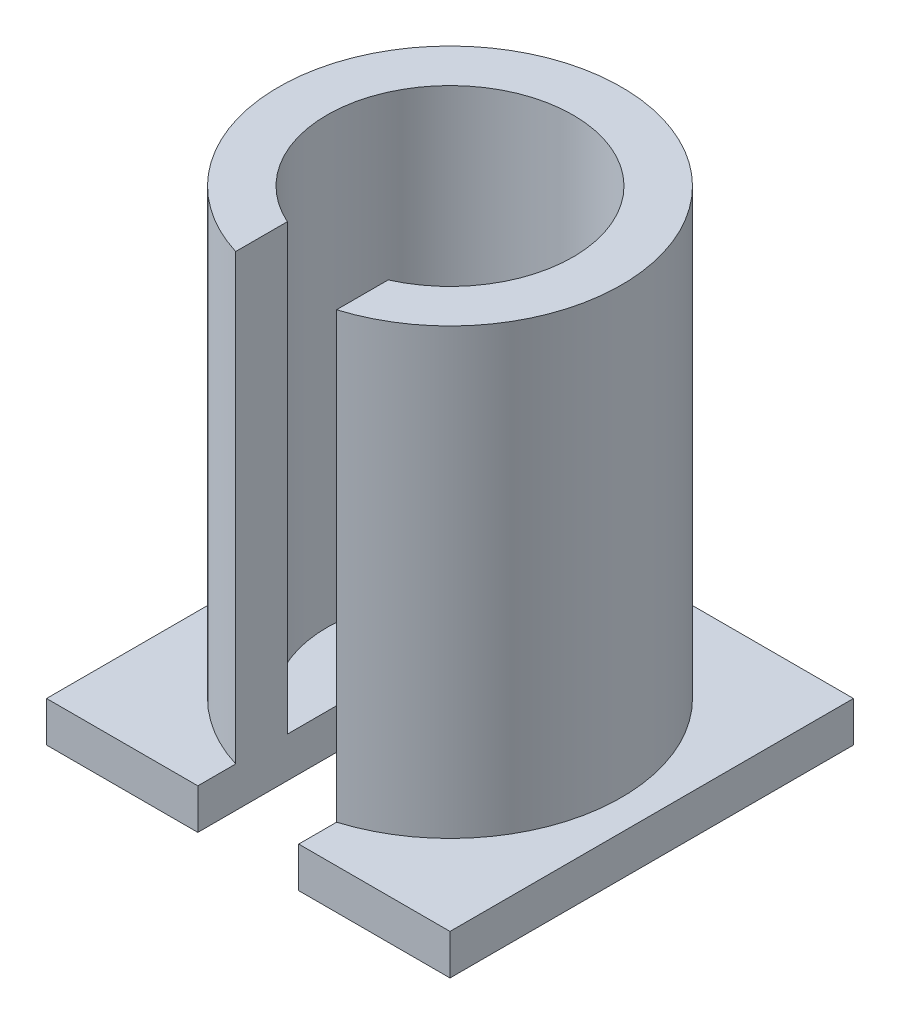
ISO-10303-21;
HEADER;
FILE_DESCRIPTION(('STEP AP214'),'2;1');
FILE_NAME('part.step','',(''),(''),'','','');
FILE_SCHEMA(('AUTOMOTIVE_DESIGN { 1 0 10303 214 1 1 1 1 }'));
ENDSEC;
DATA;
#1=APPLICATION_CONTEXT('core data for automotive mechanical design processes');
#2=APPLICATION_PROTOCOL_DEFINITION('international standard','automotive_design',2000,#1);
#3=PRODUCT_CONTEXT('',#1,'mechanical');
#4=PRODUCT('Part','Part','',(#3));
#5=PRODUCT_RELATED_PRODUCT_CATEGORY('part','',(#4));
#6=PRODUCT_DEFINITION_FORMATION('','',#4);
#7=PRODUCT_DEFINITION_CONTEXT('part definition',#1,'design');
#8=PRODUCT_DEFINITION('design','',#6,#7);
#9=PRODUCT_DEFINITION_SHAPE('','',#8);
#10=(LENGTH_UNIT() NAMED_UNIT(*) SI_UNIT(.MILLI.,.METRE.));
#11=(NAMED_UNIT(*) PLANE_ANGLE_UNIT() SI_UNIT($,.RADIAN.));
#12=(NAMED_UNIT(*) SI_UNIT($,.STERADIAN.) SOLID_ANGLE_UNIT());
#13=UNCERTAINTY_MEASURE_WITH_UNIT(LENGTH_MEASURE(1.E-05),#10,'distance_accuracy_value','');
#14=(GEOMETRIC_REPRESENTATION_CONTEXT(3) GLOBAL_UNCERTAINTY_ASSIGNED_CONTEXT((#13)) GLOBAL_UNIT_ASSIGNED_CONTEXT((#10,
#11,#12)) REPRESENTATION_CONTEXT('',''));
#15=CARTESIAN_POINT('',(0.,0.,0.));
#16=DIRECTION('',(0.,0.,1.));
#17=DIRECTION('',(1.,0.,0.));
#18=AXIS2_PLACEMENT_3D('',#15,#16,#17);
#19=CARTESIAN_POINT('',(0.,12.,0.));
#20=DIRECTION('',(0.,-1.,0.));
#21=DIRECTION('',(0.,0.,-1.));
#22=AXIS2_PLACEMENT_3D('',#19,#20,#21);
#23=CYLINDRICAL_SURFACE('',#22,4.25);
#24=DIRECTION('',(0.,-1.,0.));
#25=VECTOR('',#24,1.);
#26=CARTESIAN_POINT('',(1.25,12.,4.06201920231798));
#27=LINE('',#26,#25);
#28=CARTESIAN_POINT('',(1.25,12.,4.06201920231798));
#29=VERTEX_POINT('',#28);
#30=CARTESIAN_POINT('',(1.25,1.,4.06201920231798));
#31=VERTEX_POINT('',#30);
#32=EDGE_CURVE('E56',#29,#31,#27,.T.);
#33=ORIENTED_EDGE('',*,*,#32,.T.);
#34=CARTESIAN_POINT('',(0.,1.,0.));
#35=DIRECTION('',(0.,1.,0.));
#36=DIRECTION('',(0.,0.,1.));
#37=AXIS2_PLACEMENT_3D('',#34,#35,#36);
#38=CIRCLE('',#37,4.25);
#39=CARTESIAN_POINT('',(-1.25,1.,4.06201920231798));
#40=VERTEX_POINT('',#39);
#41=EDGE_CURVE('E60',#31,#40,#38,.T.);
#42=ORIENTED_EDGE('',*,*,#41,.T.);
#43=DIRECTION('',(0.,-1.,0.));
#44=VECTOR('',#43,1.);
#45=CARTESIAN_POINT('',(-1.25,12.,4.06201920231798));
#46=LINE('',#45,#44);
#47=CARTESIAN_POINT('',(-1.25,12.,4.06201920231798));
#48=VERTEX_POINT('',#47);
#49=EDGE_CURVE('E236',#48,#40,#46,.T.);
#50=ORIENTED_EDGE('',*,*,#49,.F.);
#51=CARTESIAN_POINT('',(0.,12.,0.));
#52=DIRECTION('',(0.,1.,0.));
#53=DIRECTION('',(0.,0.,1.));
#54=AXIS2_PLACEMENT_3D('',#51,#52,#53);
#55=CIRCLE('',#54,4.25);
#56=EDGE_CURVE('E244',#29,#48,#55,.T.);
#57=ORIENTED_EDGE('',*,*,#56,.F.);
#58=EDGE_LOOP('',(#33,#42,#50,#57));
#59=FACE_BOUND('',#58,.T.);
#60=ADVANCED_FACE('F41',(#59),#23,.T.);
#61=CARTESIAN_POINT('',(0.,12.,0.));
#62=DIRECTION('',(0.,-1.,0.));
#63=DIRECTION('',(0.,0.,-1.));
#64=AXIS2_PLACEMENT_3D('',#61,#62,#63);
#65=CYLINDRICAL_SURFACE('',#64,3.05);
#66=CARTESIAN_POINT('',(0.,12.,0.));
#67=DIRECTION('',(0.,1.,0.));
#68=DIRECTION('',(0.,0.,1.));
#69=AXIS2_PLACEMENT_3D('',#66,#67,#68);
#70=CIRCLE('',#69,3.05);
#71=CARTESIAN_POINT('',(1.25,12.,2.78208554864871));
#72=VERTEX_POINT('',#71);
#73=CARTESIAN_POINT('',(-1.25,12.,2.78208554864871));
#74=VERTEX_POINT('',#73);
#75=EDGE_CURVE('E251',#72,#74,#70,.T.);
#76=ORIENTED_EDGE('',*,*,#75,.T.);
#77=DIRECTION('',(0.,-1.,0.));
#78=VECTOR('',#77,1.);
#79=CARTESIAN_POINT('',(-1.25,12.,2.78208554864871));
#80=LINE('',#79,#78);
#81=CARTESIAN_POINT('',(-1.25,1.,2.78208554864871));
#82=VERTEX_POINT('',#81);
#83=EDGE_CURVE('E228',#74,#82,#80,.T.);
#84=ORIENTED_EDGE('',*,*,#83,.T.);
#85=CARTESIAN_POINT('',(0.,1.,0.));
#86=DIRECTION('',(0.,1.,0.));
#87=DIRECTION('',(0.,0.,1.));
#88=AXIS2_PLACEMENT_3D('',#85,#86,#87);
#89=CIRCLE('',#88,3.05);
#90=CARTESIAN_POINT('',(1.25,1.,2.78208554864871));
#91=VERTEX_POINT('',#90);
#92=EDGE_CURVE('E255',#91,#82,#89,.T.);
#93=ORIENTED_EDGE('',*,*,#92,.F.);
#94=DIRECTION('',(0.,-1.,0.));
#95=VECTOR('',#94,1.);
#96=CARTESIAN_POINT('',(1.25,12.,2.78208554864871));
#97=LINE('',#96,#95);
#98=EDGE_CURVE('E216',#72,#91,#97,.T.);
#99=ORIENTED_EDGE('',*,*,#98,.F.);
#100=EDGE_LOOP('',(#76,#84,#93,#99));
#101=FACE_BOUND('',#100,.T.);
#102=ADVANCED_FACE('F275',(#101),#65,.F.);
#103=CARTESIAN_POINT('',(0.,12.,0.));
#104=DIRECTION('',(0.,1.,0.));
#105=DIRECTION('',(0.,0.,1.));
#106=AXIS2_PLACEMENT_3D('',#103,#104,#105);
#107=PLANE('',#106);
#108=ORIENTED_EDGE('',*,*,#56,.T.);
#109=DIRECTION('',(0.,0.,-1.));
#110=VECTOR('',#109,1.);
#111=CARTESIAN_POINT('',(-1.25,12.,0.));
#112=LINE('',#111,#110);
#113=EDGE_CURVE('E232',#48,#74,#112,.T.);
#114=ORIENTED_EDGE('',*,*,#113,.T.);
#115=ORIENTED_EDGE('',*,*,#75,.F.);
#116=DIRECTION('',(0.,0.,-1.));
#117=VECTOR('',#116,1.);
#118=CARTESIAN_POINT('',(1.25,12.,0.));
#119=LINE('',#118,#117);
#120=EDGE_CURVE('E219',#29,#72,#119,.T.);
#121=ORIENTED_EDGE('',*,*,#120,.F.);
#122=EDGE_LOOP('',(#108,#114,#115,#121));
#123=FACE_BOUND('',#122,.T.);
#124=ADVANCED_FACE('F278',(#123),#107,.T.);
#125=CARTESIAN_POINT('',(0.,0.,0.));
#126=DIRECTION('',(0.,1.,0.));
#127=DIRECTION('',(0.,0.,1.));
#128=AXIS2_PLACEMENT_3D('',#125,#126,#127);
#129=PLANE('',#128);
#130=DIRECTION('',(0.,0.,1.));
#131=VECTOR('',#130,1.);
#132=CARTESIAN_POINT('',(-1.25,0.,0.));
#133=LINE('',#132,#131);
#134=CARTESIAN_POINT('',(-1.25,0.,0.));
#135=VERTEX_POINT('',#134);
#136=CARTESIAN_POINT('',(-1.25,0.,5.));
#137=VERTEX_POINT('',#136);
#138=EDGE_CURVE('E208',#135,#137,#133,.T.);
#139=ORIENTED_EDGE('',*,*,#138,.T.);
#140=DIRECTION('',(-1.,0.,0.));
#141=VECTOR('',#140,1.);
#142=CARTESIAN_POINT('',(0.,0.,5.));
#143=LINE('',#142,#141);
#144=CARTESIAN_POINT('',(-5.,0.,5.));
#145=VERTEX_POINT('',#144);
#146=EDGE_CURVE('E137',#137,#145,#143,.T.);
#147=ORIENTED_EDGE('',*,*,#146,.T.);
#148=DIRECTION('',(0.,0.,-1.));
#149=VECTOR('',#148,1.);
#150=CARTESIAN_POINT('',(-5.,0.,0.));
#151=LINE('',#150,#149);
#152=CARTESIAN_POINT('',(-5.,0.,-5.));
#153=VERTEX_POINT('',#152);
#154=EDGE_CURVE('E187',#145,#153,#151,.T.);
#155=ORIENTED_EDGE('',*,*,#154,.T.);
#156=DIRECTION('',(-1.,0.,0.));
#157=VECTOR('',#156,1.);
#158=CARTESIAN_POINT('',(0.,0.,-5.));
#159=LINE('',#158,#157);
#160=CARTESIAN_POINT('',(5.,0.,-5.));
#161=VERTEX_POINT('',#160);
#162=EDGE_CURVE('E183',#161,#153,#159,.T.);
#163=ORIENTED_EDGE('',*,*,#162,.F.);
#164=DIRECTION('',(0.,0.,-1.));
#165=VECTOR('',#164,1.);
#166=CARTESIAN_POINT('',(5.,0.,0.));
#167=LINE('',#166,#165);
#168=CARTESIAN_POINT('',(5.,0.,5.));
#169=VERTEX_POINT('',#168);
#170=EDGE_CURVE('E180',#169,#161,#167,.T.);
#171=ORIENTED_EDGE('',*,*,#170,.F.);
#172=CARTESIAN_POINT('',(1.25,0.,5.));
#173=VERTEX_POINT('',#172);
#174=EDGE_CURVE('E177',#169,#173,#143,.T.);
#175=ORIENTED_EDGE('',*,*,#174,.T.);
#176=DIRECTION('',(0.,0.,1.));
#177=VECTOR('',#176,1.);
#178=CARTESIAN_POINT('',(1.25,0.,0.));
#179=LINE('',#178,#177);
#180=CARTESIAN_POINT('',(1.25,0.,0.));
#181=VERTEX_POINT('',#180);
#182=EDGE_CURVE('E143',#181,#173,#179,.T.);
#183=ORIENTED_EDGE('',*,*,#182,.F.);
#184=CARTESIAN_POINT('',(0.,0.,0.));
#185=DIRECTION('',(0.,1.,0.));
#186=DIRECTION('',(0.,0.,1.));
#187=AXIS2_PLACEMENT_3D('',#184,#185,#186);
#188=CIRCLE('',#187,1.25);
#189=EDGE_CURVE('E239',#181,#135,#188,.T.);
#190=ORIENTED_EDGE('',*,*,#189,.T.);
#191=EDGE_LOOP('',(#139,#147,#155,#163,#171,#175,#183,#190));
#192=FACE_BOUND('',#191,.T.);
#193=ADVANCED_FACE('F265',(#192),#129,.F.);
#194=CARTESIAN_POINT('',(0.,1.,0.));
#195=DIRECTION('',(0.,1.,0.));
#196=DIRECTION('',(0.,0.,1.));
#197=AXIS2_PLACEMENT_3D('',#194,#195,#196);
#198=PLANE('',#197);
#199=ORIENTED_EDGE('',*,*,#92,.T.);
#200=DIRECTION('',(0.,0.,-1.));
#201=VECTOR('',#200,1.);
#202=CARTESIAN_POINT('',(-1.25,1.,0.));
#203=LINE('',#202,#201);
#204=CARTESIAN_POINT('',(-1.25,1.,0.));
#205=VERTEX_POINT('',#204);
#206=EDGE_CURVE('E224',#82,#205,#203,.T.);
#207=ORIENTED_EDGE('',*,*,#206,.T.);
#208=CARTESIAN_POINT('',(0.,1.,0.));
#209=DIRECTION('',(0.,1.,0.));
#210=DIRECTION('',(0.,0.,1.));
#211=AXIS2_PLACEMENT_3D('',#208,#209,#210);
#212=CIRCLE('',#211,1.25);
#213=CARTESIAN_POINT('',(1.25,1.,0.));
#214=VERTEX_POINT('',#213);
#215=EDGE_CURVE('E240',#214,#205,#212,.T.);
#216=ORIENTED_EDGE('',*,*,#215,.F.);
#217=DIRECTION('',(0.,0.,-1.));
#218=VECTOR('',#217,1.);
#219=CARTESIAN_POINT('',(1.25,1.,0.));
#220=LINE('',#219,#218);
#221=EDGE_CURVE('E213',#91,#214,#220,.T.);
#222=ORIENTED_EDGE('',*,*,#221,.F.);
#223=EDGE_LOOP('',(#199,#207,#216,#222));
#224=FACE_BOUND('',#223,.T.);
#225=ADVANCED_FACE('F271',(#224),#198,.T.);
#226=CARTESIAN_POINT('',(0.,1.,0.));
#227=DIRECTION('',(0.,-1.,0.));
#228=DIRECTION('',(0.,0.,-1.));
#229=AXIS2_PLACEMENT_3D('',#226,#227,#228);
#230=CYLINDRICAL_SURFACE('',#229,1.25);
#231=ORIENTED_EDGE('',*,*,#215,.T.);
#232=DIRECTION('',(0.,-1.,0.));
#233=VECTOR('',#232,1.);
#234=CARTESIAN_POINT('',(-1.25,1.,0.));
#235=LINE('',#234,#233);
#236=EDGE_CURVE('E11',#205,#135,#235,.T.);
#237=ORIENTED_EDGE('',*,*,#236,.T.);
#238=ORIENTED_EDGE('',*,*,#189,.F.);
#239=DIRECTION('',(0.,-1.,0.));
#240=VECTOR('',#239,1.);
#241=CARTESIAN_POINT('',(1.25,1.,0.));
#242=LINE('',#241,#240);
#243=EDGE_CURVE('E49',#214,#181,#242,.T.);
#244=ORIENTED_EDGE('',*,*,#243,.F.);
#245=EDGE_LOOP('',(#231,#237,#238,#244));
#246=FACE_BOUND('',#245,.T.);
#247=ADVANCED_FACE('F267',(#246),#230,.F.);
#248=CARTESIAN_POINT('',(1.25,15.,0.));
#249=DIRECTION('',(1.,0.,0.));
#250=DIRECTION('',(0.,0.,-1.));
#251=AXIS2_PLACEMENT_3D('',#248,#249,#250);
#252=PLANE('',#251);
#253=ORIENTED_EDGE('',*,*,#98,.T.);
#254=ORIENTED_EDGE('',*,*,#221,.T.);
#255=ORIENTED_EDGE('',*,*,#243,.T.);
#256=ORIENTED_EDGE('',*,*,#182,.T.);
#257=DIRECTION('',(0.,-1.,0.));
#258=VECTOR('',#257,1.);
#259=CARTESIAN_POINT('',(1.25,1.,5.));
#260=LINE('',#259,#258);
#261=CARTESIAN_POINT('',(1.25,1.,5.));
#262=VERTEX_POINT('',#261);
#263=EDGE_CURVE('E140',#262,#173,#260,.T.);
#264=ORIENTED_EDGE('',*,*,#263,.F.);
#265=DIRECTION('',(0.,0.,1.));
#266=VECTOR('',#265,1.);
#267=CARTESIAN_POINT('',(1.25,1.,0.));
#268=LINE('',#267,#266);
#269=EDGE_CURVE('E129',#31,#262,#268,.T.);
#270=ORIENTED_EDGE('',*,*,#269,.F.);
#271=ORIENTED_EDGE('',*,*,#32,.F.);
#272=ORIENTED_EDGE('',*,*,#120,.T.);
#273=EDGE_LOOP('',(#253,#254,#255,#256,#264,#270,#271,#272));
#274=FACE_BOUND('',#273,.T.);
#275=ADVANCED_FACE('F141',(#274),#252,.F.);
#276=CARTESIAN_POINT('',(-1.25,15.,0.));
#277=DIRECTION('',(1.,0.,0.));
#278=DIRECTION('',(0.,0.,-1.));
#279=AXIS2_PLACEMENT_3D('',#276,#277,#278);
#280=PLANE('',#279);
#281=ORIENTED_EDGE('',*,*,#49,.T.);
#282=DIRECTION('',(0.,0.,1.));
#283=VECTOR('',#282,1.);
#284=CARTESIAN_POINT('',(-1.25,1.,0.));
#285=LINE('',#284,#283);
#286=CARTESIAN_POINT('',(-1.25,1.,5.));
#287=VERTEX_POINT('',#286);
#288=EDGE_CURVE('E161',#40,#287,#285,.T.);
#289=ORIENTED_EDGE('',*,*,#288,.T.);
#290=DIRECTION('',(0.,-1.,0.));
#291=VECTOR('',#290,1.);
#292=CARTESIAN_POINT('',(-1.25,1.,5.));
#293=LINE('',#292,#291);
#294=EDGE_CURVE('E168',#287,#137,#293,.T.);
#295=ORIENTED_EDGE('',*,*,#294,.T.);
#296=ORIENTED_EDGE('',*,*,#138,.F.);
#297=ORIENTED_EDGE('',*,*,#236,.F.);
#298=ORIENTED_EDGE('',*,*,#206,.F.);
#299=ORIENTED_EDGE('',*,*,#83,.F.);
#300=ORIENTED_EDGE('',*,*,#113,.F.);
#301=EDGE_LOOP('',(#281,#289,#295,#296,#297,#298,#299,#300));
#302=FACE_BOUND('',#301,.T.);
#303=ADVANCED_FACE('F269',(#302),#280,.T.);
#304=CARTESIAN_POINT('',(0.,1.,0.));
#305=DIRECTION('',(0.,1.,0.));
#306=DIRECTION('',(0.,0.,1.));
#307=AXIS2_PLACEMENT_3D('',#304,#305,#306);
#308=PLANE('',#307);
#309=ORIENTED_EDGE('',*,*,#41,.F.);
#310=ORIENTED_EDGE('',*,*,#269,.T.);
#311=DIRECTION('',(-1.,0.,0.));
#312=VECTOR('',#311,1.);
#313=CARTESIAN_POINT('',(0.,1.,5.));
#314=LINE('',#313,#312);
#315=CARTESIAN_POINT('',(5.,1.,5.));
#316=VERTEX_POINT('',#315);
#317=EDGE_CURVE('E133',#316,#262,#314,.T.);
#318=ORIENTED_EDGE('',*,*,#317,.F.);
#319=DIRECTION('',(0.,0.,-1.));
#320=VECTOR('',#319,1.);
#321=CARTESIAN_POINT('',(5.,1.,0.));
#322=LINE('',#321,#320);
#323=CARTESIAN_POINT('',(5.,1.,-5.));
#324=VERTEX_POINT('',#323);
#325=EDGE_CURVE('E153',#316,#324,#322,.T.);
#326=ORIENTED_EDGE('',*,*,#325,.T.);
#327=DIRECTION('',(-1.,0.,0.));
#328=VECTOR('',#327,1.);
#329=CARTESIAN_POINT('',(0.,1.,-5.));
#330=LINE('',#329,#328);
#331=CARTESIAN_POINT('',(-5.,1.,-5.));
#332=VERTEX_POINT('',#331);
#333=EDGE_CURVE('E157',#324,#332,#330,.T.);
#334=ORIENTED_EDGE('',*,*,#333,.T.);
#335=DIRECTION('',(0.,0.,-1.));
#336=VECTOR('',#335,1.);
#337=CARTESIAN_POINT('',(-5.,1.,0.));
#338=LINE('',#337,#336);
#339=CARTESIAN_POINT('',(-5.,1.,5.));
#340=VERTEX_POINT('',#339);
#341=EDGE_CURVE('E162',#340,#332,#338,.T.);
#342=ORIENTED_EDGE('',*,*,#341,.F.);
#343=EDGE_CURVE('E155',#287,#340,#314,.T.);
#344=ORIENTED_EDGE('',*,*,#343,.F.);
#345=ORIENTED_EDGE('',*,*,#288,.F.);
#346=EDGE_LOOP('',(#309,#310,#318,#326,#334,#342,#344,#345));
#347=FACE_BOUND('',#346,.T.);
#348=ADVANCED_FACE('F131',(#347),#308,.T.);
#349=CARTESIAN_POINT('',(0.,1.,5.));
#350=DIRECTION('',(0.,0.,1.));
#351=DIRECTION('',(1.,0.,0.));
#352=AXIS2_PLACEMENT_3D('',#349,#350,#351);
#353=PLANE('',#352);
#354=ORIENTED_EDGE('',*,*,#174,.F.);
#355=DIRECTION('',(0.,-1.,0.));
#356=VECTOR('',#355,1.);
#357=CARTESIAN_POINT('',(5.,1.,5.));
#358=LINE('',#357,#356);
#359=EDGE_CURVE('E148',#316,#169,#358,.T.);
#360=ORIENTED_EDGE('',*,*,#359,.F.);
#361=ORIENTED_EDGE('',*,*,#317,.T.);
#362=ORIENTED_EDGE('',*,*,#263,.T.);
#363=EDGE_LOOP('',(#354,#360,#361,#362));
#364=FACE_BOUND('',#363,.T.);
#365=ADVANCED_FACE('F150',(#364),#353,.T.);
#366=CARTESIAN_POINT('',(5.,1.,0.));
#367=DIRECTION('',(-1.,0.,0.));
#368=DIRECTION('',(0.,0.,1.));
#369=AXIS2_PLACEMENT_3D('',#366,#367,#368);
#370=PLANE('',#369);
#371=ORIENTED_EDGE('',*,*,#170,.T.);
#372=DIRECTION('',(0.,-1.,0.));
#373=VECTOR('',#372,1.);
#374=CARTESIAN_POINT('',(5.,1.,-5.));
#375=LINE('',#374,#373);
#376=EDGE_CURVE('E200',#324,#161,#375,.T.);
#377=ORIENTED_EDGE('',*,*,#376,.F.);
#378=ORIENTED_EDGE('',*,*,#325,.F.);
#379=ORIENTED_EDGE('',*,*,#359,.T.);
#380=EDGE_LOOP('',(#371,#377,#378,#379));
#381=FACE_BOUND('',#380,.T.);
#382=ADVANCED_FACE('F300',(#381),#370,.F.);
#383=CARTESIAN_POINT('',(0.,1.,-5.));
#384=DIRECTION('',(0.,0.,1.));
#385=DIRECTION('',(1.,0.,0.));
#386=AXIS2_PLACEMENT_3D('',#383,#384,#385);
#387=PLANE('',#386);
#388=ORIENTED_EDGE('',*,*,#162,.T.);
#389=DIRECTION('',(0.,-1.,0.));
#390=VECTOR('',#389,1.);
#391=CARTESIAN_POINT('',(-5.,1.,-5.));
#392=LINE('',#391,#390);
#393=EDGE_CURVE('E197',#332,#153,#392,.T.);
#394=ORIENTED_EDGE('',*,*,#393,.F.);
#395=ORIENTED_EDGE('',*,*,#333,.F.);
#396=ORIENTED_EDGE('',*,*,#376,.T.);
#397=EDGE_LOOP('',(#388,#394,#395,#396));
#398=FACE_BOUND('',#397,.T.);
#399=ADVANCED_FACE('F284',(#398),#387,.F.);
#400=CARTESIAN_POINT('',(-5.,1.,0.));
#401=DIRECTION('',(-1.,0.,0.));
#402=DIRECTION('',(0.,0.,1.));
#403=AXIS2_PLACEMENT_3D('',#400,#401,#402);
#404=PLANE('',#403);
#405=ORIENTED_EDGE('',*,*,#154,.F.);
#406=DIRECTION('',(0.,-1.,0.));
#407=VECTOR('',#406,1.);
#408=CARTESIAN_POINT('',(-5.,1.,5.));
#409=LINE('',#408,#407);
#410=EDGE_CURVE('E194',#340,#145,#409,.T.);
#411=ORIENTED_EDGE('',*,*,#410,.F.);
#412=ORIENTED_EDGE('',*,*,#341,.T.);
#413=ORIENTED_EDGE('',*,*,#393,.T.);
#414=EDGE_LOOP('',(#405,#411,#412,#413));
#415=FACE_BOUND('',#414,.T.);
#416=ADVANCED_FACE('F287',(#415),#404,.T.);
#417=ORIENTED_EDGE('',*,*,#146,.F.);
#418=ORIENTED_EDGE('',*,*,#294,.F.);
#419=ORIENTED_EDGE('',*,*,#343,.T.);
#420=ORIENTED_EDGE('',*,*,#410,.T.);
#421=EDGE_LOOP('',(#417,#418,#419,#420));
#422=FACE_BOUND('',#421,.T.);
#423=ADVANCED_FACE('F291',(#422),#353,.T.);
#424=CLOSED_SHELL('',(#60,#102,#124,#193,#225,#247,#275,#303,#348,#365,#382,#399,#416,#423));
#425=MANIFOLD_SOLID_BREP('B2',#424);
#426=ADVANCED_BREP_SHAPE_REPRESENTATION('',(#18,#425),#14);
#427=SHAPE_DEFINITION_REPRESENTATION(#9,#426);
ENDSEC;
END-ISO-10303-21;
